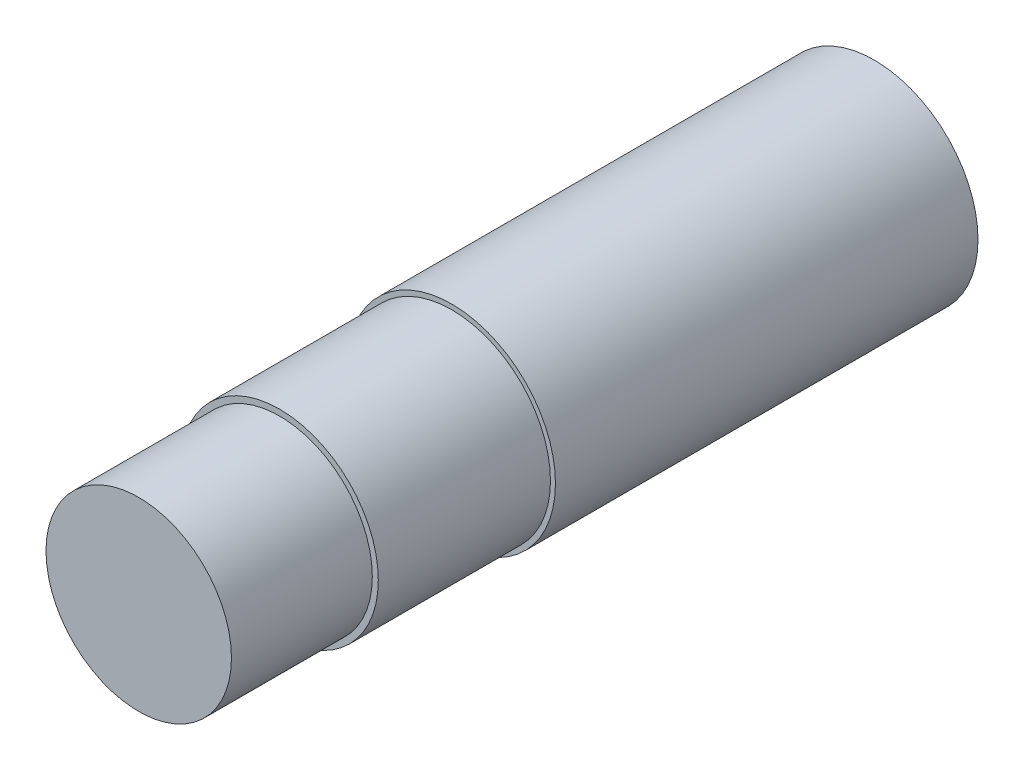
ISO-10303-21;
HEADER;
FILE_DESCRIPTION(('STEP AP214'),'2;1');
FILE_NAME('part.step','',(''),(''),'','','');
FILE_SCHEMA(('AUTOMOTIVE_DESIGN { 1 0 10303 214 1 1 1 1 }'));
ENDSEC;
DATA;
#1=APPLICATION_CONTEXT('core data for automotive mechanical design processes');
#2=APPLICATION_PROTOCOL_DEFINITION('international standard','automotive_design',2000,#1);
#3=PRODUCT_CONTEXT('',#1,'mechanical');
#4=PRODUCT('Part','Part','',(#3));
#5=PRODUCT_RELATED_PRODUCT_CATEGORY('part','',(#4));
#6=PRODUCT_DEFINITION_FORMATION('','',#4);
#7=PRODUCT_DEFINITION_CONTEXT('part definition',#1,'design');
#8=PRODUCT_DEFINITION('design','',#6,#7);
#9=PRODUCT_DEFINITION_SHAPE('','',#8);
#10=(LENGTH_UNIT() NAMED_UNIT(*) SI_UNIT(.MILLI.,.METRE.));
#11=(NAMED_UNIT(*) PLANE_ANGLE_UNIT() SI_UNIT($,.RADIAN.));
#12=(NAMED_UNIT(*) SI_UNIT($,.STERADIAN.) SOLID_ANGLE_UNIT());
#13=UNCERTAINTY_MEASURE_WITH_UNIT(LENGTH_MEASURE(1.E-05),#10,'distance_accuracy_value','');
#14=(GEOMETRIC_REPRESENTATION_CONTEXT(3) GLOBAL_UNCERTAINTY_ASSIGNED_CONTEXT((#13)) GLOBAL_UNIT_ASSIGNED_CONTEXT((#10,
#11,#12)) REPRESENTATION_CONTEXT('',''));
#15=CARTESIAN_POINT('',(0.,0.,0.));
#16=DIRECTION('',(0.,0.,1.));
#17=DIRECTION('',(1.,0.,0.));
#18=AXIS2_PLACEMENT_3D('',#15,#16,#17);
#19=CARTESIAN_POINT('',(0.,0.,27.));
#20=DIRECTION('',(0.,0.,-1.));
#21=DIRECTION('',(-1.,0.,0.));
#22=AXIS2_PLACEMENT_3D('',#19,#20,#21);
#23=CYLINDRICAL_SURFACE('',#22,6.625);
#24=CARTESIAN_POINT('',(0.,0.,27.));
#25=DIRECTION('',(0.,0.,1.));
#26=DIRECTION('',(1.,0.,0.));
#27=AXIS2_PLACEMENT_3D('',#24,#25,#26);
#28=CIRCLE('',#27,6.625);
#29=CARTESIAN_POINT('',(6.625,0.,27.));
#30=VERTEX_POINT('',#29);
#31=EDGE_CURVE('E47',#30,#30,#28,.T.);
#32=ORIENTED_EDGE('',*,*,#31,.F.);
#33=EDGE_LOOP('',(#32));
#34=FACE_BOUND('',#33,.T.);
#35=CARTESIAN_POINT('',(0.,0.,0.));
#36=DIRECTION('',(0.,0.,1.));
#37=DIRECTION('',(1.,0.,0.));
#38=AXIS2_PLACEMENT_3D('',#35,#36,#37);
#39=CIRCLE('',#38,6.625);
#40=CARTESIAN_POINT('',(6.625,0.,0.));
#41=VERTEX_POINT('',#40);
#42=EDGE_CURVE('E42',#41,#41,#39,.T.);
#43=ORIENTED_EDGE('',*,*,#42,.T.);
#44=EDGE_LOOP('',(#43));
#45=FACE_BOUND('',#44,.T.);
#46=ADVANCED_FACE('F39',(#34,#45),#23,.T.);
#47=CARTESIAN_POINT('',(0.,0.,27.));
#48=DIRECTION('',(0.,0.,1.));
#49=DIRECTION('',(1.,0.,0.));
#50=AXIS2_PLACEMENT_3D('',#47,#48,#49);
#51=PLANE('',#50);
#52=CARTESIAN_POINT('',(0.,0.,27.));
#53=DIRECTION('',(0.,0.,1.));
#54=DIRECTION('',(1.,0.,0.));
#55=AXIS2_PLACEMENT_3D('',#52,#53,#54);
#56=CIRCLE('',#55,6.30720449842838);
#57=CARTESIAN_POINT('',(6.30720449842838,0.,27.));
#58=VERTEX_POINT('',#57);
#59=EDGE_CURVE('E60',#58,#58,#56,.F.);
#60=ORIENTED_EDGE('',*,*,#59,.T.);
#61=EDGE_LOOP('',(#60));
#62=FACE_BOUND('',#61,.T.);
#63=ORIENTED_EDGE('',*,*,#31,.T.);
#64=EDGE_LOOP('',(#63));
#65=FACE_BOUND('',#64,.T.);
#66=ADVANCED_FACE('F73',(#62,#65),#51,.T.);
#67=CARTESIAN_POINT('',(0.,0.,0.));
#68=DIRECTION('',(0.,0.,1.));
#69=DIRECTION('',(1.,0.,0.));
#70=AXIS2_PLACEMENT_3D('',#67,#68,#69);
#71=PLANE('',#70);
#72=ORIENTED_EDGE('',*,*,#42,.F.);
#73=EDGE_LOOP('',(#72));
#74=FACE_BOUND('',#73,.T.);
#75=ADVANCED_FACE('F70',(#74),#71,.F.);
#76=CARTESIAN_POINT('',(0.,0.,38.));
#77=DIRECTION('',(0.,0.,-1.));
#78=DIRECTION('',(-1.,0.,0.));
#79=AXIS2_PLACEMENT_3D('',#76,#77,#78);
#80=CYLINDRICAL_SURFACE('',#79,6.30720449842838);
#81=ORIENTED_EDGE('',*,*,#59,.F.);
#82=EDGE_LOOP('',(#81));
#83=FACE_BOUND('',#82,.T.);
#84=CARTESIAN_POINT('',(0.,0.,38.));
#85=DIRECTION('',(0.,0.,1.));
#86=DIRECTION('',(1.,0.,0.));
#87=AXIS2_PLACEMENT_3D('',#84,#85,#86);
#88=CIRCLE('',#87,6.30720449842838);
#89=CARTESIAN_POINT('',(6.30720449842838,0.,38.));
#90=VERTEX_POINT('',#89);
#91=EDGE_CURVE('E56',#90,#90,#88,.T.);
#92=ORIENTED_EDGE('',*,*,#91,.F.);
#93=EDGE_LOOP('',(#92));
#94=FACE_BOUND('',#93,.T.);
#95=ADVANCED_FACE('F72',(#83,#94),#80,.T.);
#96=CARTESIAN_POINT('',(0.,0.,38.));
#97=DIRECTION('',(0.,0.,1.));
#98=DIRECTION('',(1.,0.,0.));
#99=AXIS2_PLACEMENT_3D('',#96,#97,#98);
#100=PLANE('',#99);
#101=CARTESIAN_POINT('',(0.,0.,38.));
#102=DIRECTION('',(0.,0.,1.));
#103=DIRECTION('',(1.,0.,0.));
#104=AXIS2_PLACEMENT_3D('',#101,#102,#103);
#105=CIRCLE('',#104,5.92501815949063);
#106=CARTESIAN_POINT('',(5.92501815949063,0.,38.));
#107=VERTEX_POINT('',#106);
#108=EDGE_CURVE('E10',#107,#107,#105,.T.);
#109=ORIENTED_EDGE('',*,*,#108,.F.);
#110=EDGE_LOOP('',(#109));
#111=FACE_BOUND('',#110,.T.);
#112=ORIENTED_EDGE('',*,*,#91,.T.);
#113=EDGE_LOOP('',(#112));
#114=FACE_BOUND('',#113,.T.);
#115=ADVANCED_FACE('F78',(#111,#114),#100,.T.);
#116=CARTESIAN_POINT('',(0.,0.,47.));
#117=DIRECTION('',(0.,0.,-1.));
#118=DIRECTION('',(-1.,0.,0.));
#119=AXIS2_PLACEMENT_3D('',#116,#117,#118);
#120=CYLINDRICAL_SURFACE('',#119,5.92501815949063);
#121=CARTESIAN_POINT('',(0.,0.,47.));
#122=DIRECTION('',(0.,0.,1.));
#123=DIRECTION('',(1.,0.,0.));
#124=AXIS2_PLACEMENT_3D('',#121,#122,#123);
#125=CIRCLE('',#124,5.92501815949063);
#126=CARTESIAN_POINT('',(5.92501815949063,0.,47.));
#127=VERTEX_POINT('',#126);
#128=EDGE_CURVE('E55',#127,#127,#125,.T.);
#129=ORIENTED_EDGE('',*,*,#128,.F.);
#130=EDGE_LOOP('',(#129));
#131=FACE_BOUND('',#130,.T.);
#132=ORIENTED_EDGE('',*,*,#108,.T.);
#133=EDGE_LOOP('',(#132));
#134=FACE_BOUND('',#133,.T.);
#135=ADVANCED_FACE('F111',(#131,#134),#120,.T.);
#136=CARTESIAN_POINT('',(0.,0.,47.));
#137=DIRECTION('',(0.,0.,1.));
#138=DIRECTION('',(1.,0.,0.));
#139=AXIS2_PLACEMENT_3D('',#136,#137,#138);
#140=PLANE('',#139);
#141=ORIENTED_EDGE('',*,*,#128,.T.);
#142=EDGE_LOOP('',(#141));
#143=FACE_BOUND('',#142,.T.);
#144=ADVANCED_FACE('F119',(#143),#140,.T.);
#145=CLOSED_SHELL('',(#46,#66,#75,#95,#115,#135,#144));
#146=MANIFOLD_SOLID_BREP('B2',#145);
#147=ADVANCED_BREP_SHAPE_REPRESENTATION('',(#18,#146),#14);
#148=SHAPE_DEFINITION_REPRESENTATION(#9,#147);
ENDSEC;
END-ISO-10303-21;
